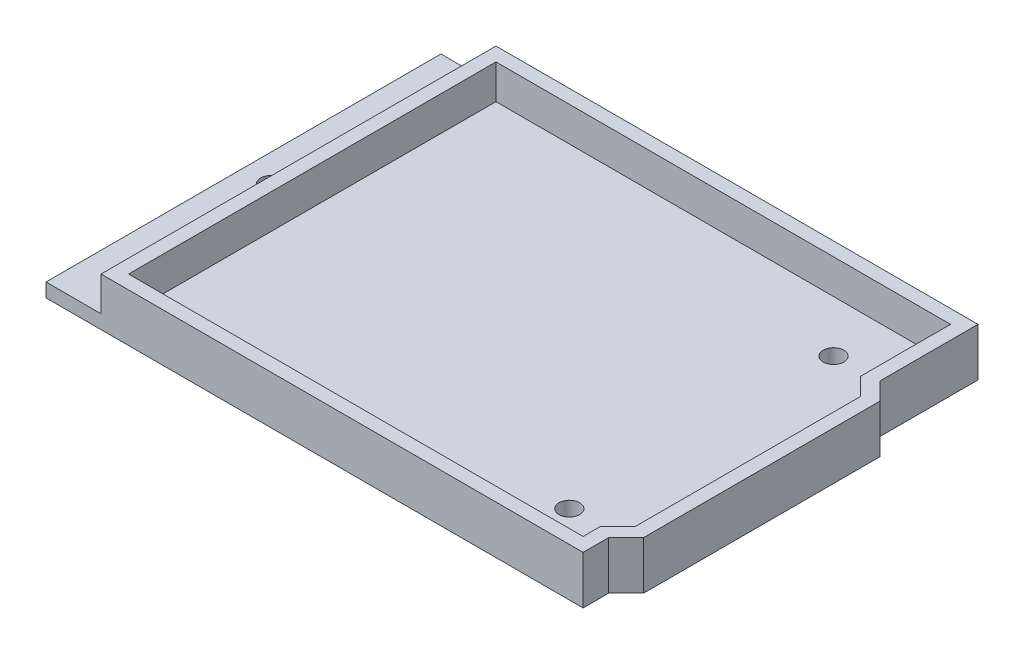
ISO-10303-21;
HEADER;
FILE_DESCRIPTION(('STEP AP214'),'2;1');
FILE_NAME('part.step','',(''),(''),'','','');
FILE_SCHEMA(('AUTOMOTIVE_DESIGN { 1 0 10303 214 1 1 1 1 }'));
ENDSEC;
DATA;
#1=APPLICATION_CONTEXT('core data for automotive mechanical design processes');
#2=APPLICATION_PROTOCOL_DEFINITION('international standard','automotive_design',2000,#1);
#3=PRODUCT_CONTEXT('',#1,'mechanical');
#4=PRODUCT('Part','Part','',(#3));
#5=PRODUCT_RELATED_PRODUCT_CATEGORY('part','',(#4));
#6=PRODUCT_DEFINITION_FORMATION('','',#4);
#7=PRODUCT_DEFINITION_CONTEXT('part definition',#1,'design');
#8=PRODUCT_DEFINITION('design','',#6,#7);
#9=PRODUCT_DEFINITION_SHAPE('','',#8);
#10=(LENGTH_UNIT() NAMED_UNIT(*) SI_UNIT(.MILLI.,.METRE.));
#11=(NAMED_UNIT(*) PLANE_ANGLE_UNIT() SI_UNIT($,.RADIAN.));
#12=(NAMED_UNIT(*) SI_UNIT($,.STERADIAN.) SOLID_ANGLE_UNIT());
#13=UNCERTAINTY_MEASURE_WITH_UNIT(LENGTH_MEASURE(1.E-05),#10,'distance_accuracy_value','');
#14=(GEOMETRIC_REPRESENTATION_CONTEXT(3) GLOBAL_UNCERTAINTY_ASSIGNED_CONTEXT((#13)) GLOBAL_UNIT_ASSIGNED_CONTEXT((#10,
#11,#12)) REPRESENTATION_CONTEXT('',''));
#15=CARTESIAN_POINT('',(0.,0.,0.));
#16=DIRECTION('',(0.,0.,1.));
#17=DIRECTION('',(1.,0.,0.));
#18=AXIS2_PLACEMENT_3D('',#15,#16,#17);
#19=CARTESIAN_POINT('',(0.,0.,0.));
#20=DIRECTION('',(0.,1.,0.));
#21=DIRECTION('',(0.,0.,1.));
#22=AXIS2_PLACEMENT_3D('',#19,#20,#21);
#23=PLANE('',#22);
#24=CARTESIAN_POINT('',(26.4266846361185,0.,-3.82396658388387));
#25=DIRECTION('',(0.,1.,0.));
#26=DIRECTION('',(0.,0.,1.));
#27=AXIS2_PLACEMENT_3D('',#24,#25,#26);
#28=CIRCLE('',#27,3.);
#29=CARTESIAN_POINT('',(26.4266846361185,0.,-0.823966583883869));
#30=VERTEX_POINT('',#29);
#31=EDGE_CURVE('E315',#30,#30,#28,.F.);
#32=ORIENTED_EDGE('',*,*,#31,.F.);
#33=EDGE_LOOP('',(#32));
#34=FACE_BOUND('',#33,.T.);
#35=DIRECTION('',(0.707106781186555,0.,0.70710678118654));
#36=VECTOR('',#35,1.);
#37=CARTESIAN_POINT('',(18.5145391723739,0.,-18.5145391723743));
#38=LINE('',#37,#36);
#39=CARTESIAN_POINT('',(37.9266846361186,0.,0.897606291369995));
#40=VERTEX_POINT('',#39);
#41=CARTESIAN_POINT('',(40.4666846361186,0.,3.43760629136994));
#42=VERTEX_POINT('',#41);
#43=EDGE_CURVE('E221',#40,#42,#38,.T.);
#44=ORIENTED_EDGE('',*,*,#43,.T.);
#45=DIRECTION('',(0.,0.,1.));
#46=VECTOR('',#45,1.);
#47=CARTESIAN_POINT('',(40.4666846361186,0.,0.));
#48=LINE('',#47,#46);
#49=CARTESIAN_POINT('',(40.4666846361186,0.,37.8244605408623));
#50=VERTEX_POINT('',#49);
#51=EDGE_CURVE('E226',#42,#50,#48,.T.);
#52=ORIENTED_EDGE('',*,*,#51,.T.);
#53=DIRECTION('',(0.707106781186549,0.,-0.707106781186547));
#54=VECTOR('',#53,1.);
#55=CARTESIAN_POINT('',(39.1455725884904,0.,39.1455725884905));
#56=LINE('',#55,#54);
#57=CARTESIAN_POINT('',(37.9266846361186,0.,40.3644605408623));
#58=VERTEX_POINT('',#57);
#59=EDGE_CURVE('E273',#58,#50,#56,.T.);
#60=ORIENTED_EDGE('',*,*,#59,.F.);
#61=DIRECTION('',(0.,0.,-1.));
#62=VECTOR('',#61,1.);
#63=CARTESIAN_POINT('',(37.9266846361183,0.,-2.83620179004542E-13));
#64=LINE('',#63,#62);
#65=CARTESIAN_POINT('',(37.9266846361186,0.,44.0760334161161));
#66=VERTEX_POINT('',#65);
#67=EDGE_CURVE('E271',#66,#58,#64,.T.);
#68=ORIENTED_EDGE('',*,*,#67,.F.);
#69=DIRECTION('',(1.,0.,0.));
#70=VECTOR('',#69,1.);
#71=CARTESIAN_POINT('',(0.,0.,44.0760334161161));
#72=LINE('',#71,#70);
#73=CARTESIAN_POINT('',(-40.1333153638814,0.,44.0760334161161));
#74=VERTEX_POINT('',#73);
#75=EDGE_CURVE('E269',#74,#66,#72,.T.);
#76=ORIENTED_EDGE('',*,*,#75,.F.);
#77=DIRECTION('',(0.,0.,1.));
#78=VECTOR('',#77,1.);
#79=CARTESIAN_POINT('',(-40.1333153638814,0.,-13.3239665838838));
#80=LINE('',#79,#78);
#81=CARTESIAN_POINT('',(-40.1333153638814,0.,-13.3239665838838));
#82=VERTEX_POINT('',#81);
#83=EDGE_CURVE('E184',#82,#74,#80,.T.);
#84=ORIENTED_EDGE('',*,*,#83,.F.);
#85=DIRECTION('',(1.,0.,0.));
#86=VECTOR('',#85,1.);
#87=CARTESIAN_POINT('',(0.,0.,-13.3239665838839));
#88=LINE('',#87,#86);
#89=CARTESIAN_POINT('',(37.9266846361186,0.,-13.3239665838839));
#90=VERTEX_POINT('',#89);
#91=EDGE_CURVE('E266',#82,#90,#88,.T.);
#92=ORIENTED_EDGE('',*,*,#91,.T.);
#93=DIRECTION('',(0.,0.,1.));
#94=VECTOR('',#93,1.);
#95=CARTESIAN_POINT('',(37.9266846361186,0.,0.));
#96=LINE('',#95,#94);
#97=EDGE_CURVE('E263',#90,#40,#96,.T.);
#98=ORIENTED_EDGE('',*,*,#97,.T.);
#99=EDGE_LOOP('',(#44,#52,#60,#68,#76,#84,#92,#98));
#100=FACE_BOUND('',#99,.T.);
#101=CARTESIAN_POINT('',(26.4266846361185,0.,34.5760334161161));
#102=DIRECTION('',(0.,1.,0.));
#103=DIRECTION('',(0.,0.,1.));
#104=AXIS2_PLACEMENT_3D('',#101,#102,#103);
#105=CIRCLE('',#104,3.);
#106=CARTESIAN_POINT('',(26.4266846361185,0.,37.5760334161161));
#107=VERTEX_POINT('',#106);
#108=EDGE_CURVE('E300',#107,#107,#105,.F.);
#109=ORIENTED_EDGE('',*,*,#108,.F.);
#110=EDGE_LOOP('',(#109));
#111=FACE_BOUND('',#110,.T.);
#112=CARTESIAN_POINT('',(-36.1333153638814,0.,15.3760334161161));
#113=DIRECTION('',(0.,1.,0.));
#114=DIRECTION('',(0.,0.,1.));
#115=AXIS2_PLACEMENT_3D('',#112,#113,#114);
#116=CIRCLE('',#115,3.);
#117=CARTESIAN_POINT('',(-36.1333153638814,0.,18.3760334161162));
#118=VERTEX_POINT('',#117);
#119=EDGE_CURVE('E318',#118,#118,#116,.F.);
#120=ORIENTED_EDGE('',*,*,#119,.F.);
#121=EDGE_LOOP('',(#120));
#122=FACE_BOUND('',#121,.T.);
#123=ADVANCED_FACE('F35',(#34,#100,#111,#122),#23,.F.);
#124=CARTESIAN_POINT('',(-32.1333153638814,7.,0.));
#125=DIRECTION('',(1.,0.,0.));
#126=DIRECTION('',(0.,0.,-1.));
#127=AXIS2_PLACEMENT_3D('',#124,#125,#126);
#128=PLANE('',#127);
#129=DIRECTION('',(0.,0.,-1.));
#130=VECTOR('',#129,1.);
#131=CARTESIAN_POINT('',(-32.1333153638814,2.,44.0760334161161));
#132=LINE('',#131,#130);
#133=CARTESIAN_POINT('',(-32.1333153638814,2.,44.0760334161161));
#134=VERTEX_POINT('',#133);
#135=CARTESIAN_POINT('',(-32.1333153638814,2.,-13.3239665838838));
#136=VERTEX_POINT('',#135);
#137=EDGE_CURVE('E50',#134,#136,#132,.T.);
#138=ORIENTED_EDGE('',*,*,#137,.F.);
#139=DIRECTION('',(0.,-1.,0.));
#140=VECTOR('',#139,1.);
#141=CARTESIAN_POINT('',(-32.1333153638814,7.,44.0760334161161));
#142=LINE('',#141,#140);
#143=CARTESIAN_POINT('',(-32.1333153638814,7.,44.0760334161161));
#144=VERTEX_POINT('',#143);
#145=EDGE_CURVE('E169',#144,#134,#142,.T.);
#146=ORIENTED_EDGE('',*,*,#145,.F.);
#147=DIRECTION('',(0.,0.,1.));
#148=VECTOR('',#147,1.);
#149=CARTESIAN_POINT('',(-32.1333153638814,7.,0.));
#150=LINE('',#149,#148);
#151=CARTESIAN_POINT('',(-32.1333153638814,7.,-13.3239665838838));
#152=VERTEX_POINT('',#151);
#153=EDGE_CURVE('E164',#152,#144,#150,.T.);
#154=ORIENTED_EDGE('',*,*,#153,.F.);
#155=DIRECTION('',(0.,-1.,0.));
#156=VECTOR('',#155,1.);
#157=CARTESIAN_POINT('',(-32.1333153638814,7.,-13.3239665838838));
#158=LINE('',#157,#156);
#159=EDGE_CURVE('E161',#152,#136,#158,.T.);
#160=ORIENTED_EDGE('',*,*,#159,.T.);
#161=EDGE_LOOP('',(#138,#146,#154,#160));
#162=FACE_BOUND('',#161,.T.);
#163=ADVANCED_FACE('F163',(#162),#128,.F.);
#164=CARTESIAN_POINT('',(37.7313590261173,7.,37.7313590261174));
#165=DIRECTION('',(0.707106781186547,0.,0.707106781186548));
#166=DIRECTION('',(0.707106781186548,0.,-0.707106781186547));
#167=AXIS2_PLACEMENT_3D('',#164,#165,#166);
#168=PLANE('',#167);
#169=DIRECTION('',(0.707106781186549,0.,-0.707106781186546));
#170=VECTOR('',#169,1.);
#171=CARTESIAN_POINT('',(38.4666846361186,2.,36.9960334161161));
#172=LINE('',#171,#170);
#173=CARTESIAN_POINT('',(35.9266846361186,2.,39.5360334161161));
#174=VERTEX_POINT('',#173);
#175=CARTESIAN_POINT('',(38.4666846361186,2.,36.9960334161161));
#176=VERTEX_POINT('',#175);
#177=EDGE_CURVE('E58',#174,#176,#172,.T.);
#178=ORIENTED_EDGE('',*,*,#177,.F.);
#179=DIRECTION('',(0.,-1.,0.));
#180=VECTOR('',#179,1.);
#181=CARTESIAN_POINT('',(35.9266846361186,7.,39.5360334161161));
#182=LINE('',#181,#180);
#183=CARTESIAN_POINT('',(35.9266846361186,7.,39.5360334161161));
#184=VERTEX_POINT('',#183);
#185=EDGE_CURVE('E298',#184,#174,#182,.T.);
#186=ORIENTED_EDGE('',*,*,#185,.F.);
#187=DIRECTION('',(-0.707106781186548,0.,0.707106781186547));
#188=VECTOR('',#187,1.);
#189=CARTESIAN_POINT('',(37.7313590261173,7.,37.7313590261174));
#190=LINE('',#189,#188);
#191=CARTESIAN_POINT('',(38.4666846361186,7.,36.9960334161161));
#192=VERTEX_POINT('',#191);
#193=EDGE_CURVE('E241',#192,#184,#190,.T.);
#194=ORIENTED_EDGE('',*,*,#193,.F.);
#195=DIRECTION('',(0.,-1.,0.));
#196=VECTOR('',#195,1.);
#197=CARTESIAN_POINT('',(38.4666846361186,7.,36.9960334161161));
#198=LINE('',#197,#196);
#199=EDGE_CURVE('E278',#192,#176,#198,.T.);
#200=ORIENTED_EDGE('',*,*,#199,.T.);
#201=EDGE_LOOP('',(#178,#186,#194,#200));
#202=FACE_BOUND('',#201,.T.);
#203=ADVANCED_FACE('F353',(#202),#168,.F.);
#204=CARTESIAN_POINT('',(35.9266846361186,7.,0.));
#205=DIRECTION('',(1.,0.,0.));
#206=DIRECTION('',(0.,0.,-1.));
#207=AXIS2_PLACEMENT_3D('',#204,#205,#206);
#208=PLANE('',#207);
#209=DIRECTION('',(0.,0.,-1.));
#210=VECTOR('',#209,1.);
#211=CARTESIAN_POINT('',(35.9266846361186,2.,39.5360334161161));
#212=LINE('',#211,#210);
#213=CARTESIAN_POINT('',(35.9266846361186,2.,42.0760334161161));
#214=VERTEX_POINT('',#213);
#215=EDGE_CURVE('E205',#214,#174,#212,.T.);
#216=ORIENTED_EDGE('',*,*,#215,.F.);
#217=DIRECTION('',(0.,-1.,0.));
#218=VECTOR('',#217,1.);
#219=CARTESIAN_POINT('',(35.9266846361186,7.,42.0760334161161));
#220=LINE('',#219,#218);
#221=CARTESIAN_POINT('',(35.9266846361186,7.,42.0760334161161));
#222=VERTEX_POINT('',#221);
#223=EDGE_CURVE('E295',#222,#214,#220,.T.);
#224=ORIENTED_EDGE('',*,*,#223,.F.);
#225=DIRECTION('',(0.,0.,1.));
#226=VECTOR('',#225,1.);
#227=CARTESIAN_POINT('',(35.9266846361186,7.,0.));
#228=LINE('',#227,#226);
#229=EDGE_CURVE('E244',#184,#222,#228,.T.);
#230=ORIENTED_EDGE('',*,*,#229,.F.);
#231=ORIENTED_EDGE('',*,*,#185,.T.);
#232=EDGE_LOOP('',(#216,#224,#230,#231));
#233=FACE_BOUND('',#232,.T.);
#234=ADVANCED_FACE('F385',(#233),#208,.F.);
#235=CARTESIAN_POINT('',(0.,7.,42.0760334161161));
#236=DIRECTION('',(0.,0.,-1.));
#237=DIRECTION('',(-1.,0.,0.));
#238=AXIS2_PLACEMENT_3D('',#235,#236,#237);
#239=PLANE('',#238);
#240=ORIENTED_EDGE('',*,*,#223,.T.);
#241=DIRECTION('',(1.,0.,0.));
#242=VECTOR('',#241,1.);
#243=CARTESIAN_POINT('',(35.9266846361186,2.,42.0760334161161));
#244=LINE('',#243,#242);
#245=CARTESIAN_POINT('',(-30.1333153638814,2.,42.0760334161161));
#246=VERTEX_POINT('',#245);
#247=EDGE_CURVE('E202',#246,#214,#244,.T.);
#248=ORIENTED_EDGE('',*,*,#247,.F.);
#249=DIRECTION('',(0.,-1.,0.));
#250=VECTOR('',#249,1.);
#251=CARTESIAN_POINT('',(-30.1333153638814,7.,42.0760334161161));
#252=LINE('',#251,#250);
#253=CARTESIAN_POINT('',(-30.1333153638814,7.,42.0760334161161));
#254=VERTEX_POINT('',#253);
#255=EDGE_CURVE('E292',#254,#246,#252,.T.);
#256=ORIENTED_EDGE('',*,*,#255,.F.);
#257=DIRECTION('',(1.,0.,0.));
#258=VECTOR('',#257,1.);
#259=CARTESIAN_POINT('',(0.,7.,42.0760334161161));
#260=LINE('',#259,#258);
#261=EDGE_CURVE('E246',#254,#222,#260,.T.);
#262=ORIENTED_EDGE('',*,*,#261,.T.);
#263=EDGE_LOOP('',(#240,#248,#256,#262));
#264=FACE_BOUND('',#263,.T.);
#265=ADVANCED_FACE('F381',(#264),#239,.T.);
#266=CARTESIAN_POINT('',(-30.1333153638814,7.,0.));
#267=DIRECTION('',(1.,0.,0.));
#268=DIRECTION('',(0.,0.,-1.));
#269=AXIS2_PLACEMENT_3D('',#266,#267,#268);
#270=PLANE('',#269);
#271=ORIENTED_EDGE('',*,*,#255,.T.);
#272=DIRECTION('',(0.,0.,1.));
#273=VECTOR('',#272,1.);
#274=CARTESIAN_POINT('',(-30.1333153638814,2.,42.0760334161161));
#275=LINE('',#274,#273);
#276=CARTESIAN_POINT('',(-30.1333153638814,2.,-11.3239665838838));
#277=VERTEX_POINT('',#276);
#278=EDGE_CURVE('E199',#277,#246,#275,.T.);
#279=ORIENTED_EDGE('',*,*,#278,.F.);
#280=DIRECTION('',(0.,-1.,0.));
#281=VECTOR('',#280,1.);
#282=CARTESIAN_POINT('',(-30.1333153638814,7.,-11.3239665838838));
#283=LINE('',#282,#281);
#284=CARTESIAN_POINT('',(-30.1333153638814,7.,-11.3239665838838));
#285=VERTEX_POINT('',#284);
#286=EDGE_CURVE('E289',#285,#277,#283,.T.);
#287=ORIENTED_EDGE('',*,*,#286,.F.);
#288=DIRECTION('',(0.,0.,1.));
#289=VECTOR('',#288,1.);
#290=CARTESIAN_POINT('',(-30.1333153638814,7.,0.));
#291=LINE('',#290,#289);
#292=EDGE_CURVE('E249',#285,#254,#291,.T.);
#293=ORIENTED_EDGE('',*,*,#292,.T.);
#294=EDGE_LOOP('',(#271,#279,#287,#293));
#295=FACE_BOUND('',#294,.T.);
#296=ADVANCED_FACE('F377',(#295),#270,.T.);
#297=CARTESIAN_POINT('',(0.,7.,-11.3239665838839));
#298=DIRECTION('',(0.,0.,-1.));
#299=DIRECTION('',(-1.,0.,0.));
#300=AXIS2_PLACEMENT_3D('',#297,#298,#299);
#301=PLANE('',#300);
#302=DIRECTION('',(-1.,0.,0.));
#303=VECTOR('',#302,1.);
#304=CARTESIAN_POINT('',(-30.1333153638814,2.,-11.3239665838838));
#305=LINE('',#304,#303);
#306=CARTESIAN_POINT('',(35.9266846361186,2.,-11.3239665838839));
#307=VERTEX_POINT('',#306);
#308=EDGE_CURVE('E218',#307,#277,#305,.T.);
#309=ORIENTED_EDGE('',*,*,#308,.F.);
#310=DIRECTION('',(0.,-1.,0.));
#311=VECTOR('',#310,1.);
#312=CARTESIAN_POINT('',(35.9266846361186,7.,-11.3239665838839));
#313=LINE('',#312,#311);
#314=CARTESIAN_POINT('',(35.9266846361186,7.,-11.3239665838839));
#315=VERTEX_POINT('',#314);
#316=EDGE_CURVE('E286',#315,#307,#313,.T.);
#317=ORIENTED_EDGE('',*,*,#316,.F.);
#318=DIRECTION('',(1.,0.,0.));
#319=VECTOR('',#318,1.);
#320=CARTESIAN_POINT('',(0.,7.,-11.3239665838839));
#321=LINE('',#320,#319);
#322=EDGE_CURVE('E252',#285,#315,#321,.T.);
#323=ORIENTED_EDGE('',*,*,#322,.F.);
#324=ORIENTED_EDGE('',*,*,#286,.T.);
#325=EDGE_LOOP('',(#309,#317,#323,#324));
#326=FACE_BOUND('',#325,.T.);
#327=ADVANCED_FACE('F373',(#326),#301,.F.);
#328=CARTESIAN_POINT('',(35.9266846361186,7.,1.52822346672282E-13));
#329=DIRECTION('',(1.,0.,0.));
#330=DIRECTION('',(0.,0.,-1.));
#331=AXIS2_PLACEMENT_3D('',#328,#329,#330);
#332=PLANE('',#331);
#333=DIRECTION('',(0.,0.,-1.));
#334=VECTOR('',#333,1.);
#335=CARTESIAN_POINT('',(35.9266846361186,2.,-11.3239665838839));
#336=LINE('',#335,#334);
#337=CARTESIAN_POINT('',(35.9266846361186,2.,1.7260334161162));
#338=VERTEX_POINT('',#337);
#339=EDGE_CURVE('E215',#338,#307,#336,.T.);
#340=ORIENTED_EDGE('',*,*,#339,.F.);
#341=DIRECTION('',(0.,-1.,0.));
#342=VECTOR('',#341,1.);
#343=CARTESIAN_POINT('',(35.9266846361186,7.,1.7260334161162));
#344=LINE('',#343,#342);
#345=CARTESIAN_POINT('',(35.9266846361186,7.,1.7260334161162));
#346=VERTEX_POINT('',#345);
#347=EDGE_CURVE('E283',#346,#338,#344,.T.);
#348=ORIENTED_EDGE('',*,*,#347,.F.);
#349=DIRECTION('',(0.,0.,1.));
#350=VECTOR('',#349,1.);
#351=CARTESIAN_POINT('',(35.9266846361186,7.,1.52822346672282E-13));
#352=LINE('',#351,#350);
#353=EDGE_CURVE('E254',#315,#346,#352,.T.);
#354=ORIENTED_EDGE('',*,*,#353,.F.);
#355=ORIENTED_EDGE('',*,*,#316,.T.);
#356=EDGE_LOOP('',(#340,#348,#354,#355));
#357=FACE_BOUND('',#356,.T.);
#358=ADVANCED_FACE('F369',(#357),#332,.F.);
#359=CARTESIAN_POINT('',(17.1003256100009,7.,-17.1003256100012));
#360=DIRECTION('',(0.707106781186542,0.,-0.707106781186553));
#361=DIRECTION('',(-0.707106781186553,0.,-0.707106781186542));
#362=AXIS2_PLACEMENT_3D('',#359,#360,#361);
#363=PLANE('',#362);
#364=DIRECTION('',(-0.707106781186553,0.,-0.707106781186542));
#365=VECTOR('',#364,1.);
#366=CARTESIAN_POINT('',(35.9266846361186,2.,1.7260334161162));
#367=LINE('',#366,#365);
#368=CARTESIAN_POINT('',(38.4666846361186,2.,4.26603341611614));
#369=VERTEX_POINT('',#368);
#370=EDGE_CURVE('E212',#369,#338,#367,.T.);
#371=ORIENTED_EDGE('',*,*,#370,.F.);
#372=DIRECTION('',(0.,-1.,0.));
#373=VECTOR('',#372,1.);
#374=CARTESIAN_POINT('',(38.4666846361186,7.,4.26603341611614));
#375=LINE('',#374,#373);
#376=CARTESIAN_POINT('',(38.4666846361186,7.,4.26603341611614));
#377=VERTEX_POINT('',#376);
#378=EDGE_CURVE('E280',#377,#369,#375,.T.);
#379=ORIENTED_EDGE('',*,*,#378,.F.);
#380=DIRECTION('',(0.707106781186553,0.,0.707106781186542));
#381=VECTOR('',#380,1.);
#382=CARTESIAN_POINT('',(17.1003256100009,7.,-17.1003256100012));
#383=LINE('',#382,#381);
#384=EDGE_CURVE('E256',#346,#377,#383,.T.);
#385=ORIENTED_EDGE('',*,*,#384,.F.);
#386=ORIENTED_EDGE('',*,*,#347,.T.);
#387=EDGE_LOOP('',(#371,#379,#385,#386));
#388=FACE_BOUND('',#387,.T.);
#389=ADVANCED_FACE('F365',(#388),#363,.F.);
#390=CARTESIAN_POINT('',(38.4666846361186,7.,0.));
#391=DIRECTION('',(1.,0.,0.));
#392=DIRECTION('',(0.,0.,-1.));
#393=AXIS2_PLACEMENT_3D('',#390,#391,#392);
#394=PLANE('',#393);
#395=DIRECTION('',(0.,0.,-1.));
#396=VECTOR('',#395,1.);
#397=CARTESIAN_POINT('',(38.4666846361186,2.,4.26603341611614));
#398=LINE('',#397,#396);
#399=EDGE_CURVE('E209',#176,#369,#398,.T.);
#400=ORIENTED_EDGE('',*,*,#399,.F.);
#401=ORIENTED_EDGE('',*,*,#199,.F.);
#402=DIRECTION('',(0.,0.,1.));
#403=VECTOR('',#402,1.);
#404=CARTESIAN_POINT('',(38.4666846361186,7.,0.));
#405=LINE('',#404,#403);
#406=EDGE_CURVE('E258',#377,#192,#405,.T.);
#407=ORIENTED_EDGE('',*,*,#406,.F.);
#408=ORIENTED_EDGE('',*,*,#378,.T.);
#409=EDGE_LOOP('',(#400,#401,#407,#408));
#410=FACE_BOUND('',#409,.T.);
#411=ADVANCED_FACE('F361',(#410),#394,.F.);
#412=CARTESIAN_POINT('',(18.5145391723739,7.,-18.5145391723743));
#413=DIRECTION('',(0.70710678118654,0.,-0.707106781186555));
#414=DIRECTION('',(-0.707106781186555,0.,-0.70710678118654));
#415=AXIS2_PLACEMENT_3D('',#412,#413,#414);
#416=PLANE('',#415);
#417=ORIENTED_EDGE('',*,*,#43,.F.);
#418=DIRECTION('',(0.,-1.,0.));
#419=VECTOR('',#418,1.);
#420=CARTESIAN_POINT('',(37.9266846361186,7.,0.897606291369995));
#421=LINE('',#420,#419);
#422=CARTESIAN_POINT('',(37.9266846361186,7.,0.897606291369995));
#423=VERTEX_POINT('',#422);
#424=EDGE_CURVE('E281',#423,#40,#421,.T.);
#425=ORIENTED_EDGE('',*,*,#424,.F.);
#426=DIRECTION('',(0.707106781186555,0.,0.70710678118654));
#427=VECTOR('',#426,1.);
#428=CARTESIAN_POINT('',(18.5145391723739,7.,-18.5145391723743));
#429=LINE('',#428,#427);
#430=CARTESIAN_POINT('',(40.4666846361186,7.,3.43760629136994));
#431=VERTEX_POINT('',#430);
#432=EDGE_CURVE('E222',#423,#431,#429,.T.);
#433=ORIENTED_EDGE('',*,*,#432,.T.);
#434=DIRECTION('',(0.,-1.,0.));
#435=VECTOR('',#434,1.);
#436=CARTESIAN_POINT('',(40.4666846361186,7.,3.43760629136994));
#437=LINE('',#436,#435);
#438=EDGE_CURVE('E260',#431,#42,#437,.T.);
#439=ORIENTED_EDGE('',*,*,#438,.T.);
#440=EDGE_LOOP('',(#417,#425,#433,#439));
#441=FACE_BOUND('',#440,.T.);
#442=ADVANCED_FACE('F364',(#441),#416,.T.);
#443=CARTESIAN_POINT('',(37.9266846361186,7.,0.));
#444=DIRECTION('',(1.,0.,0.));
#445=DIRECTION('',(0.,0.,-1.));
#446=AXIS2_PLACEMENT_3D('',#443,#444,#445);
#447=PLANE('',#446);
#448=ORIENTED_EDGE('',*,*,#97,.F.);
#449=DIRECTION('',(0.,-1.,0.));
#450=VECTOR('',#449,1.);
#451=CARTESIAN_POINT('',(37.9266846361186,7.,-13.3239665838839));
#452=LINE('',#451,#450);
#453=CARTESIAN_POINT('',(37.9266846361186,7.,-13.3239665838839));
#454=VERTEX_POINT('',#453);
#455=EDGE_CURVE('E168',#454,#90,#452,.T.);
#456=ORIENTED_EDGE('',*,*,#455,.F.);
#457=DIRECTION('',(0.,0.,1.));
#458=VECTOR('',#457,1.);
#459=CARTESIAN_POINT('',(37.9266846361186,7.,0.));
#460=LINE('',#459,#458);
#461=EDGE_CURVE('E225',#454,#423,#460,.T.);
#462=ORIENTED_EDGE('',*,*,#461,.T.);
#463=ORIENTED_EDGE('',*,*,#424,.T.);
#464=EDGE_LOOP('',(#448,#456,#462,#463));
#465=FACE_BOUND('',#464,.T.);
#466=ADVANCED_FACE('F410',(#465),#447,.T.);
#467=CARTESIAN_POINT('',(0.,7.,-13.3239665838839));
#468=DIRECTION('',(0.,0.,-1.));
#469=DIRECTION('',(-1.,0.,0.));
#470=AXIS2_PLACEMENT_3D('',#467,#468,#469);
#471=PLANE('',#470);
#472=ORIENTED_EDGE('',*,*,#91,.F.);
#473=DIRECTION('',(0.,-1.,0.));
#474=VECTOR('',#473,1.);
#475=CARTESIAN_POINT('',(-40.1333153638814,2.,-13.3239665838838));
#476=LINE('',#475,#474);
#477=CARTESIAN_POINT('',(-40.1333153638814,2.,-13.3239665838838));
#478=VERTEX_POINT('',#477);
#479=EDGE_CURVE('E175',#478,#82,#476,.T.);
#480=ORIENTED_EDGE('',*,*,#479,.F.);
#481=DIRECTION('',(-1.,0.,0.));
#482=VECTOR('',#481,1.);
#483=CARTESIAN_POINT('',(-32.1333153638814,2.,-13.3239665838838));
#484=LINE('',#483,#482);
#485=EDGE_CURVE('E172',#136,#478,#484,.T.);
#486=ORIENTED_EDGE('',*,*,#485,.F.);
#487=ORIENTED_EDGE('',*,*,#159,.F.);
#488=DIRECTION('',(1.,0.,0.));
#489=VECTOR('',#488,1.);
#490=CARTESIAN_POINT('',(0.,7.,-13.3239665838839));
#491=LINE('',#490,#489);
#492=EDGE_CURVE('E229',#152,#454,#491,.T.);
#493=ORIENTED_EDGE('',*,*,#492,.T.);
#494=ORIENTED_EDGE('',*,*,#455,.T.);
#495=EDGE_LOOP('',(#472,#480,#486,#487,#493,#494));
#496=FACE_BOUND('',#495,.T.);
#497=ADVANCED_FACE('F173',(#496),#471,.T.);
#498=CARTESIAN_POINT('',(0.,7.,44.0760334161161));
#499=DIRECTION('',(0.,0.,-1.));
#500=DIRECTION('',(-1.,0.,0.));
#501=AXIS2_PLACEMENT_3D('',#498,#499,#500);
#502=PLANE('',#501);
#503=ORIENTED_EDGE('',*,*,#75,.T.);
#504=DIRECTION('',(0.,-1.,0.));
#505=VECTOR('',#504,1.);
#506=CARTESIAN_POINT('',(37.9266846361186,7.,44.0760334161161));
#507=LINE('',#506,#505);
#508=CARTESIAN_POINT('',(37.9266846361186,7.,44.0760334161161));
#509=VERTEX_POINT('',#508);
#510=EDGE_CURVE('E307',#509,#66,#507,.T.);
#511=ORIENTED_EDGE('',*,*,#510,.F.);
#512=DIRECTION('',(1.,0.,0.));
#513=VECTOR('',#512,1.);
#514=CARTESIAN_POINT('',(0.,7.,44.0760334161161));
#515=LINE('',#514,#513);
#516=EDGE_CURVE('E232',#144,#509,#515,.T.);
#517=ORIENTED_EDGE('',*,*,#516,.F.);
#518=ORIENTED_EDGE('',*,*,#145,.T.);
#519=DIRECTION('',(1.,0.,0.));
#520=VECTOR('',#519,1.);
#521=CARTESIAN_POINT('',(-40.1333153638814,2.,44.0760334161161));
#522=LINE('',#521,#520);
#523=CARTESIAN_POINT('',(-40.1333153638814,2.,44.0760334161161));
#524=VERTEX_POINT('',#523);
#525=EDGE_CURVE('E183',#524,#134,#522,.T.);
#526=ORIENTED_EDGE('',*,*,#525,.F.);
#527=DIRECTION('',(0.,-1.,0.));
#528=VECTOR('',#527,1.);
#529=CARTESIAN_POINT('',(-40.1333153638814,2.,44.0760334161161));
#530=LINE('',#529,#528);
#531=EDGE_CURVE('E194',#524,#74,#530,.T.);
#532=ORIENTED_EDGE('',*,*,#531,.T.);
#533=EDGE_LOOP('',(#503,#511,#517,#518,#526,#532));
#534=FACE_BOUND('',#533,.T.);
#535=ADVANCED_FACE('F403',(#534),#502,.F.);
#536=CARTESIAN_POINT('',(37.9266846361183,7.,-2.83620179004542E-13));
#537=DIRECTION('',(-1.,0.,0.));
#538=DIRECTION('',(0.,0.,1.));
#539=AXIS2_PLACEMENT_3D('',#536,#537,#538);
#540=PLANE('',#539);
#541=ORIENTED_EDGE('',*,*,#67,.T.);
#542=DIRECTION('',(0.,-1.,0.));
#543=VECTOR('',#542,1.);
#544=CARTESIAN_POINT('',(37.9266846361186,7.,40.3644605408623));
#545=LINE('',#544,#543);
#546=CARTESIAN_POINT('',(37.9266846361186,7.,40.3644605408623));
#547=VERTEX_POINT('',#546);
#548=EDGE_CURVE('E304',#547,#58,#545,.T.);
#549=ORIENTED_EDGE('',*,*,#548,.F.);
#550=DIRECTION('',(0.,0.,-1.));
#551=VECTOR('',#550,1.);
#552=CARTESIAN_POINT('',(37.9266846361183,7.,-2.83620179004542E-13));
#553=LINE('',#552,#551);
#554=EDGE_CURVE('E234',#509,#547,#553,.T.);
#555=ORIENTED_EDGE('',*,*,#554,.F.);
#556=ORIENTED_EDGE('',*,*,#510,.T.);
#557=EDGE_LOOP('',(#541,#549,#555,#556));
#558=FACE_BOUND('',#557,.T.);
#559=ADVANCED_FACE('F399',(#558),#540,.F.);
#560=CARTESIAN_POINT('',(39.1455725884904,7.,39.1455725884905));
#561=DIRECTION('',(-0.707106781186546,0.,-0.707106781186548));
#562=DIRECTION('',(-0.707106781186549,0.,0.707106781186547));
#563=AXIS2_PLACEMENT_3D('',#560,#561,#562);
#564=PLANE('',#563);
#565=ORIENTED_EDGE('',*,*,#59,.T.);
#566=DIRECTION('',(0.,-1.,0.));
#567=VECTOR('',#566,1.);
#568=CARTESIAN_POINT('',(40.4666846361186,7.,37.8244605408623));
#569=LINE('',#568,#567);
#570=CARTESIAN_POINT('',(40.4666846361186,7.,37.8244605408623));
#571=VERTEX_POINT('',#570);
#572=EDGE_CURVE('E302',#571,#50,#569,.T.);
#573=ORIENTED_EDGE('',*,*,#572,.F.);
#574=DIRECTION('',(0.707106781186549,0.,-0.707106781186547));
#575=VECTOR('',#574,1.);
#576=CARTESIAN_POINT('',(39.1455725884904,7.,39.1455725884905));
#577=LINE('',#576,#575);
#578=EDGE_CURVE('E236',#547,#571,#577,.T.);
#579=ORIENTED_EDGE('',*,*,#578,.F.);
#580=ORIENTED_EDGE('',*,*,#548,.T.);
#581=EDGE_LOOP('',(#565,#573,#579,#580));
#582=FACE_BOUND('',#581,.T.);
#583=ADVANCED_FACE('F395',(#582),#564,.F.);
#584=CARTESIAN_POINT('',(40.4666846361186,7.,0.));
#585=DIRECTION('',(1.,0.,0.));
#586=DIRECTION('',(0.,0.,-1.));
#587=AXIS2_PLACEMENT_3D('',#584,#585,#586);
#588=PLANE('',#587);
#589=ORIENTED_EDGE('',*,*,#51,.F.);
#590=ORIENTED_EDGE('',*,*,#438,.F.);
#591=DIRECTION('',(0.,0.,1.));
#592=VECTOR('',#591,1.);
#593=CARTESIAN_POINT('',(40.4666846361186,7.,0.));
#594=LINE('',#593,#592);
#595=EDGE_CURVE('E238',#431,#571,#594,.T.);
#596=ORIENTED_EDGE('',*,*,#595,.T.);
#597=ORIENTED_EDGE('',*,*,#572,.T.);
#598=EDGE_LOOP('',(#589,#590,#596,#597));
#599=FACE_BOUND('',#598,.T.);
#600=ADVANCED_FACE('F392',(#599),#588,.T.);
#601=CARTESIAN_POINT('',(0.,7.,0.));
#602=DIRECTION('',(0.,1.,0.));
#603=DIRECTION('',(0.,0.,1.));
#604=AXIS2_PLACEMENT_3D('',#601,#602,#603);
#605=PLANE('',#604);
#606=ORIENTED_EDGE('',*,*,#432,.F.);
#607=ORIENTED_EDGE('',*,*,#461,.F.);
#608=ORIENTED_EDGE('',*,*,#492,.F.);
#609=ORIENTED_EDGE('',*,*,#153,.T.);
#610=ORIENTED_EDGE('',*,*,#516,.T.);
#611=ORIENTED_EDGE('',*,*,#554,.T.);
#612=ORIENTED_EDGE('',*,*,#578,.T.);
#613=ORIENTED_EDGE('',*,*,#595,.F.);
#614=EDGE_LOOP('',(#606,#607,#608,#609,#610,#611,#612,#613));
#615=FACE_BOUND('',#614,.T.);
#616=ORIENTED_EDGE('',*,*,#193,.T.);
#617=ORIENTED_EDGE('',*,*,#229,.T.);
#618=ORIENTED_EDGE('',*,*,#261,.F.);
#619=ORIENTED_EDGE('',*,*,#292,.F.);
#620=ORIENTED_EDGE('',*,*,#322,.T.);
#621=ORIENTED_EDGE('',*,*,#353,.T.);
#622=ORIENTED_EDGE('',*,*,#384,.T.);
#623=ORIENTED_EDGE('',*,*,#406,.T.);
#624=EDGE_LOOP('',(#616,#617,#618,#619,#620,#621,#622,#623));
#625=FACE_BOUND('',#624,.T.);
#626=ADVANCED_FACE('F359',(#615,#625),#605,.T.);
#627=CARTESIAN_POINT('',(0.,2.,0.));
#628=DIRECTION('',(0.,-1.,0.));
#629=DIRECTION('',(0.,0.,-1.));
#630=AXIS2_PLACEMENT_3D('',#627,#628,#629);
#631=PLANE('',#630);
#632=CARTESIAN_POINT('',(26.4266846361185,2.,-3.82396658388387));
#633=DIRECTION('',(0.,1.,0.));
#634=DIRECTION('',(0.,0.,1.));
#635=AXIS2_PLACEMENT_3D('',#632,#633,#634);
#636=CIRCLE('',#635,1.5);
#637=CARTESIAN_POINT('',(26.4266846361185,2.,-2.32396658388387));
#638=VERTEX_POINT('',#637);
#639=EDGE_CURVE('E187',#638,#638,#636,.T.);
#640=ORIENTED_EDGE('',*,*,#639,.F.);
#641=EDGE_LOOP('',(#640));
#642=FACE_BOUND('',#641,.T.);
#643=CARTESIAN_POINT('',(26.4266846361185,2.,34.5760334161161));
#644=DIRECTION('',(0.,1.,0.));
#645=DIRECTION('',(0.,0.,1.));
#646=AXIS2_PLACEMENT_3D('',#643,#644,#645);
#647=CIRCLE('',#646,1.5);
#648=CARTESIAN_POINT('',(26.4266846361185,2.,36.0760334161161));
#649=VERTEX_POINT('',#648);
#650=EDGE_CURVE('E447',#649,#649,#647,.T.);
#651=ORIENTED_EDGE('',*,*,#650,.F.);
#652=EDGE_LOOP('',(#651));
#653=FACE_BOUND('',#652,.T.);
#654=ORIENTED_EDGE('',*,*,#278,.T.);
#655=ORIENTED_EDGE('',*,*,#247,.T.);
#656=ORIENTED_EDGE('',*,*,#215,.T.);
#657=ORIENTED_EDGE('',*,*,#177,.T.);
#658=ORIENTED_EDGE('',*,*,#399,.T.);
#659=ORIENTED_EDGE('',*,*,#370,.T.);
#660=ORIENTED_EDGE('',*,*,#339,.T.);
#661=ORIENTED_EDGE('',*,*,#308,.T.);
#662=EDGE_LOOP('',(#654,#655,#656,#657,#658,#659,#660,#661));
#663=FACE_BOUND('',#662,.T.);
#664=ADVANCED_FACE('F465',(#642,#653,#663),#631,.F.);
#665=CARTESIAN_POINT('',(-40.1333153638814,2.,-13.3239665838838));
#666=DIRECTION('',(1.,0.,0.));
#667=DIRECTION('',(0.,0.,-1.));
#668=AXIS2_PLACEMENT_3D('',#665,#666,#667);
#669=PLANE('',#668);
#670=ORIENTED_EDGE('',*,*,#83,.T.);
#671=ORIENTED_EDGE('',*,*,#531,.F.);
#672=DIRECTION('',(0.,0.,1.));
#673=VECTOR('',#672,1.);
#674=CARTESIAN_POINT('',(-40.1333153638814,2.,-13.3239665838838));
#675=LINE('',#674,#673);
#676=EDGE_CURVE('E178',#478,#524,#675,.T.);
#677=ORIENTED_EDGE('',*,*,#676,.F.);
#678=ORIENTED_EDGE('',*,*,#479,.T.);
#679=EDGE_LOOP('',(#670,#671,#677,#678));
#680=FACE_BOUND('',#679,.T.);
#681=ADVANCED_FACE('F457',(#680),#669,.F.);
#682=CARTESIAN_POINT('',(0.,2.,0.));
#683=DIRECTION('',(0.,1.,0.));
#684=DIRECTION('',(0.,0.,1.));
#685=AXIS2_PLACEMENT_3D('',#682,#683,#684);
#686=PLANE('',#685);
#687=CARTESIAN_POINT('',(-36.1333153638814,2.,15.3760334161161));
#688=DIRECTION('',(0.,1.,0.));
#689=DIRECTION('',(0.,0.,1.));
#690=AXIS2_PLACEMENT_3D('',#687,#688,#689);
#691=CIRCLE('',#690,1.5);
#692=CARTESIAN_POINT('',(-36.1333153638814,2.,16.8760334161162));
#693=VERTEX_POINT('',#692);
#694=EDGE_CURVE('E190',#693,#693,#691,.T.);
#695=ORIENTED_EDGE('',*,*,#694,.F.);
#696=EDGE_LOOP('',(#695));
#697=FACE_BOUND('',#696,.T.);
#698=ORIENTED_EDGE('',*,*,#137,.T.);
#699=ORIENTED_EDGE('',*,*,#485,.T.);
#700=ORIENTED_EDGE('',*,*,#676,.T.);
#701=ORIENTED_EDGE('',*,*,#525,.T.);
#702=EDGE_LOOP('',(#698,#699,#700,#701));
#703=FACE_BOUND('',#702,.T.);
#704=ADVANCED_FACE('F181',(#697,#703),#686,.T.);
#705=CARTESIAN_POINT('',(-36.1333153638814,0.,15.3760334161161));
#706=DIRECTION('',(0.,1.,0.));
#707=DIRECTION('',(0.,0.,1.));
#708=AXIS2_PLACEMENT_3D('',#705,#706,#707);
#709=CYLINDRICAL_SURFACE('',#708,1.5);
#710=ORIENTED_EDGE('',*,*,#694,.T.);
#711=EDGE_LOOP('',(#710));
#712=FACE_BOUND('',#711,.T.);
#713=CARTESIAN_POINT('',(-36.1333153638814,-1.,15.3760334161161));
#714=DIRECTION('',(0.,-1.,0.));
#715=DIRECTION('',(0.,0.,-1.));
#716=AXIS2_PLACEMENT_3D('',#713,#714,#715);
#717=CIRCLE('',#716,1.5);
#718=CARTESIAN_POINT('',(-36.1333153638814,-1.,13.8760334161161));
#719=VERTEX_POINT('',#718);
#720=EDGE_CURVE('E436',#719,#719,#717,.T.);
#721=ORIENTED_EDGE('',*,*,#720,.T.);
#722=EDGE_LOOP('',(#721));
#723=FACE_BOUND('',#722,.T.);
#724=ADVANCED_FACE('F454',(#712,#723),#709,.F.);
#725=CARTESIAN_POINT('',(26.4266846361185,0.,34.5760334161161));
#726=DIRECTION('',(0.,1.,0.));
#727=DIRECTION('',(0.,0.,1.));
#728=AXIS2_PLACEMENT_3D('',#725,#726,#727);
#729=CYLINDRICAL_SURFACE('',#728,1.5);
#730=ORIENTED_EDGE('',*,*,#650,.T.);
#731=EDGE_LOOP('',(#730));
#732=FACE_BOUND('',#731,.T.);
#733=CARTESIAN_POINT('',(26.4266846361185,-1.,34.5760334161161));
#734=DIRECTION('',(0.,-1.,0.));
#735=DIRECTION('',(0.,0.,-1.));
#736=AXIS2_PLACEMENT_3D('',#733,#734,#735);
#737=CIRCLE('',#736,1.5);
#738=CARTESIAN_POINT('',(26.4266846361185,-1.,33.0760334161161));
#739=VERTEX_POINT('',#738);
#740=EDGE_CURVE('E441',#739,#739,#737,.T.);
#741=ORIENTED_EDGE('',*,*,#740,.T.);
#742=EDGE_LOOP('',(#741));
#743=FACE_BOUND('',#742,.T.);
#744=ADVANCED_FACE('F463',(#732,#743),#729,.F.);
#745=CARTESIAN_POINT('',(26.4266846361185,0.,-3.82396658388387));
#746=DIRECTION('',(0.,1.,0.));
#747=DIRECTION('',(0.,0.,1.));
#748=AXIS2_PLACEMENT_3D('',#745,#746,#747);
#749=CYLINDRICAL_SURFACE('',#748,1.5);
#750=ORIENTED_EDGE('',*,*,#639,.T.);
#751=EDGE_LOOP('',(#750));
#752=FACE_BOUND('',#751,.T.);
#753=CARTESIAN_POINT('',(26.4266846361185,-1.,-3.82396658388387));
#754=DIRECTION('',(0.,-1.,0.));
#755=DIRECTION('',(0.,0.,-1.));
#756=AXIS2_PLACEMENT_3D('',#753,#754,#755);
#757=CIRCLE('',#756,1.5);
#758=CARTESIAN_POINT('',(26.4266846361185,-1.,-5.32396658388387));
#759=VERTEX_POINT('',#758);
#760=EDGE_CURVE('E438',#759,#759,#757,.T.);
#761=ORIENTED_EDGE('',*,*,#760,.T.);
#762=EDGE_LOOP('',(#761));
#763=FACE_BOUND('',#762,.T.);
#764=ADVANCED_FACE('F493',(#752,#763),#749,.F.);
#765=CARTESIAN_POINT('',(26.4266846361185,-1.,34.5760334161161));
#766=DIRECTION('',(0.,-1.,0.));
#767=DIRECTION('',(0.,0.,-1.));
#768=AXIS2_PLACEMENT_3D('',#765,#766,#767);
#769=PLANE('',#768);
#770=CARTESIAN_POINT('',(26.4266846361185,-1.,34.5760334161161));
#771=DIRECTION('',(0.,-1.,0.));
#772=DIRECTION('',(0.,0.,-1.));
#773=AXIS2_PLACEMENT_3D('',#770,#771,#772);
#774=CIRCLE('',#773,2.5);
#775=CARTESIAN_POINT('',(26.4266846361185,-1.,32.0760334161161));
#776=VERTEX_POINT('',#775);
#777=EDGE_CURVE('E43',#776,#776,#774,.T.);
#778=ORIENTED_EDGE('',*,*,#777,.T.);
#779=EDGE_LOOP('',(#778));
#780=FACE_BOUND('',#779,.T.);
#781=ORIENTED_EDGE('',*,*,#740,.F.);
#782=EDGE_LOOP('',(#781));
#783=FACE_BOUND('',#782,.T.);
#784=ADVANCED_FACE('F335',(#780,#783),#769,.T.);
#785=CARTESIAN_POINT('',(26.4266846361185,-1.,34.5760334161161));
#786=DIRECTION('',(0.,1.,0.));
#787=DIRECTION('',(0.,0.,1.));
#788=AXIS2_PLACEMENT_3D('',#785,#786,#787);
#789=CYLINDRICAL_SURFACE('',#788,3.);
#790=CARTESIAN_POINT('',(26.4266846361185,-0.5,34.5760334161161));
#791=DIRECTION('',(0.,-1.,0.));
#792=DIRECTION('',(0.,0.,-1.));
#793=AXIS2_PLACEMENT_3D('',#790,#791,#792);
#794=CIRCLE('',#793,3.);
#795=CARTESIAN_POINT('',(26.4266846361185,-0.5,31.5760334161161));
#796=VERTEX_POINT('',#795);
#797=EDGE_CURVE('E11',#796,#796,#794,.F.);
#798=ORIENTED_EDGE('',*,*,#797,.T.);
#799=EDGE_LOOP('',(#798));
#800=FACE_BOUND('',#799,.T.);
#801=ORIENTED_EDGE('',*,*,#108,.T.);
#802=EDGE_LOOP('',(#801));
#803=FACE_BOUND('',#802,.T.);
#804=ADVANCED_FACE('F501',(#800,#803),#789,.T.);
#805=CARTESIAN_POINT('',(26.4266846361185,-1.,-3.82396658388387));
#806=DIRECTION('',(0.,-1.,0.));
#807=DIRECTION('',(0.,0.,-1.));
#808=AXIS2_PLACEMENT_3D('',#805,#806,#807);
#809=PLANE('',#808);
#810=CARTESIAN_POINT('',(26.4266846361185,-1.,-3.82396658388387));
#811=DIRECTION('',(0.,-1.,0.));
#812=DIRECTION('',(0.,0.,-1.));
#813=AXIS2_PLACEMENT_3D('',#810,#811,#812);
#814=CIRCLE('',#813,2.5);
#815=CARTESIAN_POINT('',(26.4266846361185,-1.,-6.32396658388387));
#816=VERTEX_POINT('',#815);
#817=EDGE_CURVE('E327',#816,#816,#814,.T.);
#818=ORIENTED_EDGE('',*,*,#817,.T.);
#819=EDGE_LOOP('',(#818));
#820=FACE_BOUND('',#819,.T.);
#821=ORIENTED_EDGE('',*,*,#760,.F.);
#822=EDGE_LOOP('',(#821));
#823=FACE_BOUND('',#822,.T.);
#824=ADVANCED_FACE('F499',(#820,#823),#809,.T.);
#825=CARTESIAN_POINT('',(26.4266846361185,-1.,-3.82396658388387));
#826=DIRECTION('',(0.,1.,0.));
#827=DIRECTION('',(0.,0.,1.));
#828=AXIS2_PLACEMENT_3D('',#825,#826,#827);
#829=CYLINDRICAL_SURFACE('',#828,3.);
#830=CARTESIAN_POINT('',(26.4266846361185,-0.5,-3.82396658388387));
#831=DIRECTION('',(0.,-1.,0.));
#832=DIRECTION('',(0.,0.,-1.));
#833=AXIS2_PLACEMENT_3D('',#830,#831,#832);
#834=CIRCLE('',#833,3.);
#835=CARTESIAN_POINT('',(26.4266846361185,-0.5,-6.82396658388387));
#836=VERTEX_POINT('',#835);
#837=EDGE_CURVE('E330',#836,#836,#834,.F.);
#838=ORIENTED_EDGE('',*,*,#837,.T.);
#839=EDGE_LOOP('',(#838));
#840=FACE_BOUND('',#839,.T.);
#841=ORIENTED_EDGE('',*,*,#31,.T.);
#842=EDGE_LOOP('',(#841));
#843=FACE_BOUND('',#842,.T.);
#844=ADVANCED_FACE('F432',(#840,#843),#829,.T.);
#845=CARTESIAN_POINT('',(-36.1333153638814,-1.,15.3760334161161));
#846=DIRECTION('',(0.,-1.,0.));
#847=DIRECTION('',(0.,0.,-1.));
#848=AXIS2_PLACEMENT_3D('',#845,#846,#847);
#849=PLANE('',#848);
#850=CARTESIAN_POINT('',(-36.1333153638814,-1.,15.3760334161161));
#851=DIRECTION('',(0.,-1.,0.));
#852=DIRECTION('',(0.,0.,-1.));
#853=AXIS2_PLACEMENT_3D('',#850,#851,#852);
#854=CIRCLE('',#853,2.5);
#855=CARTESIAN_POINT('',(-36.1333153638814,-1.,12.8760334161161));
#856=VERTEX_POINT('',#855);
#857=EDGE_CURVE('E321',#856,#856,#854,.T.);
#858=ORIENTED_EDGE('',*,*,#857,.T.);
#859=EDGE_LOOP('',(#858));
#860=FACE_BOUND('',#859,.T.);
#861=ORIENTED_EDGE('',*,*,#720,.F.);
#862=EDGE_LOOP('',(#861));
#863=FACE_BOUND('',#862,.T.);
#864=ADVANCED_FACE('F423',(#860,#863),#849,.T.);
#865=CARTESIAN_POINT('',(-36.1333153638814,-1.,15.3760334161161));
#866=DIRECTION('',(0.,1.,0.));
#867=DIRECTION('',(0.,0.,1.));
#868=AXIS2_PLACEMENT_3D('',#865,#866,#867);
#869=CYLINDRICAL_SURFACE('',#868,3.);
#870=CARTESIAN_POINT('',(-36.1333153638814,-0.5,15.3760334161161));
#871=DIRECTION('',(0.,-1.,0.));
#872=DIRECTION('',(0.,0.,-1.));
#873=AXIS2_PLACEMENT_3D('',#870,#871,#872);
#874=CIRCLE('',#873,3.);
#875=CARTESIAN_POINT('',(-36.1333153638814,-0.5,12.3760334161161));
#876=VERTEX_POINT('',#875);
#877=EDGE_CURVE('E324',#876,#876,#874,.F.);
#878=ORIENTED_EDGE('',*,*,#877,.T.);
#879=EDGE_LOOP('',(#878));
#880=FACE_BOUND('',#879,.T.);
#881=ORIENTED_EDGE('',*,*,#119,.T.);
#882=EDGE_LOOP('',(#881));
#883=FACE_BOUND('',#882,.T.);
#884=ADVANCED_FACE('F418',(#880,#883),#869,.T.);
#885=CARTESIAN_POINT('',(-36.1333153638814,-0.5,15.3760334161161));
#886=DIRECTION('',(0.,-1.,0.));
#887=DIRECTION('',(0.,0.,-1.));
#888=AXIS2_PLACEMENT_3D('',#885,#886,#887);
#889=TOROIDAL_SURFACE('',#888,2.5,0.5);
#890=ORIENTED_EDGE('',*,*,#877,.F.);
#891=EDGE_LOOP('',(#890));
#892=FACE_BOUND('',#891,.T.);
#893=ORIENTED_EDGE('',*,*,#857,.F.);
#894=EDGE_LOOP('',(#893));
#895=FACE_BOUND('',#894,.T.);
#896=ADVANCED_FACE('F344',(#892,#895),#889,.T.);
#897=CARTESIAN_POINT('',(26.4266846361185,-0.5,-3.82396658388387));
#898=DIRECTION('',(0.,-1.,0.));
#899=DIRECTION('',(0.,0.,-1.));
#900=AXIS2_PLACEMENT_3D('',#897,#898,#899);
#901=TOROIDAL_SURFACE('',#900,2.5,0.5);
#902=ORIENTED_EDGE('',*,*,#837,.F.);
#903=EDGE_LOOP('',(#902));
#904=FACE_BOUND('',#903,.T.);
#905=ORIENTED_EDGE('',*,*,#817,.F.);
#906=EDGE_LOOP('',(#905));
#907=FACE_BOUND('',#906,.T.);
#908=ADVANCED_FACE('F339',(#904,#907),#901,.T.);
#909=CARTESIAN_POINT('',(26.4266846361185,-0.5,34.5760334161161));
#910=DIRECTION('',(0.,-1.,0.));
#911=DIRECTION('',(0.,0.,-1.));
#912=AXIS2_PLACEMENT_3D('',#909,#910,#911);
#913=TOROIDAL_SURFACE('',#912,2.5,0.5);
#914=ORIENTED_EDGE('',*,*,#797,.F.);
#915=EDGE_LOOP('',(#914));
#916=FACE_BOUND('',#915,.T.);
#917=ORIENTED_EDGE('',*,*,#777,.F.);
#918=EDGE_LOOP('',(#917));
#919=FACE_BOUND('',#918,.T.);
#920=ADVANCED_FACE('F37',(#916,#919),#913,.T.);
#921=CLOSED_SHELL('',(#123,#163,#203,#234,#265,#296,#327,#358,#389,#411,#442,#466,#497,#535,
#559,#583,#600,#626,#664,#681,#704,#724,#744,#764,#784,#804,#824,#844,#864,#884,#896,#908,#920));
#922=MANIFOLD_SOLID_BREP('B2',#921);
#923=ADVANCED_BREP_SHAPE_REPRESENTATION('',(#18,#922),#14);
#924=SHAPE_DEFINITION_REPRESENTATION(#9,#923);
ENDSEC;
END-ISO-10303-21;
